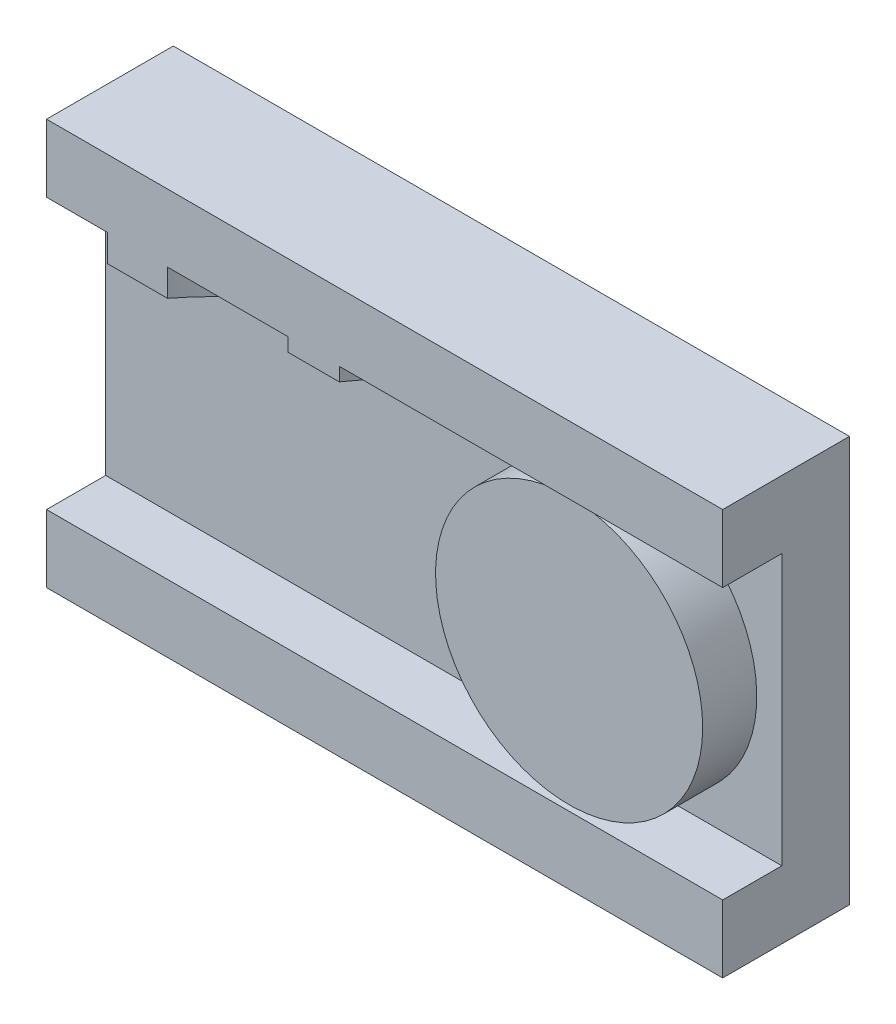
ISO-10303-21;
HEADER;
FILE_DESCRIPTION(('STEP AP214'),'2;1');
FILE_NAME('part.step','',(''),(''),'','','');
FILE_SCHEMA(('AUTOMOTIVE_DESIGN { 1 0 10303 214 1 1 1 1 }'));
ENDSEC;
DATA;
#1=APPLICATION_CONTEXT('core data for automotive mechanical design processes');
#2=APPLICATION_PROTOCOL_DEFINITION('international standard','automotive_design',2000,#1);
#3=PRODUCT_CONTEXT('',#1,'mechanical');
#4=PRODUCT('Part','Part','',(#3));
#5=PRODUCT_RELATED_PRODUCT_CATEGORY('part','',(#4));
#6=PRODUCT_DEFINITION_FORMATION('','',#4);
#7=PRODUCT_DEFINITION_CONTEXT('part definition',#1,'design');
#8=PRODUCT_DEFINITION('design','',#6,#7);
#9=PRODUCT_DEFINITION_SHAPE('','',#8);
#10=(LENGTH_UNIT() NAMED_UNIT(*) SI_UNIT(.MILLI.,.METRE.));
#11=(NAMED_UNIT(*) PLANE_ANGLE_UNIT() SI_UNIT($,.RADIAN.));
#12=(NAMED_UNIT(*) SI_UNIT($,.STERADIAN.) SOLID_ANGLE_UNIT());
#13=UNCERTAINTY_MEASURE_WITH_UNIT(LENGTH_MEASURE(1.E-05),#10,'distance_accuracy_value','');
#14=(GEOMETRIC_REPRESENTATION_CONTEXT(3) GLOBAL_UNCERTAINTY_ASSIGNED_CONTEXT((#13)) GLOBAL_UNIT_ASSIGNED_CONTEXT((#10,
#11,#12)) REPRESENTATION_CONTEXT('',''));
#15=CARTESIAN_POINT('',(0.,0.,0.));
#16=DIRECTION('',(0.,0.,1.));
#17=DIRECTION('',(1.,0.,0.));
#18=AXIS2_PLACEMENT_3D('',#15,#16,#17);
#19=CARTESIAN_POINT('',(50.,18.5267857142857,0.));
#20=DIRECTION('',(0.,-1.,0.));
#21=DIRECTION('',(0.,0.,-1.));
#22=AXIS2_PLACEMENT_3D('',#19,#20,#21);
#23=PLANE('',#22);
#24=DIRECTION('',(1.,0.,0.));
#25=VECTOR('',#24,1.);
#26=CARTESIAN_POINT('',(50.,18.5267857142857,-5.09184128727336));
#27=LINE('',#26,#25);
#28=CARTESIAN_POINT('',(21.6480697283801,18.5267857142857,-5.09184128727337));
#29=VERTEX_POINT('',#28);
#30=CARTESIAN_POINT('',(50.,18.5267857142857,-5.09184128727336));
#31=VERTEX_POINT('',#30);
#32=EDGE_CURVE('E368',#29,#31,#27,.T.);
#33=ORIENTED_EDGE('',*,*,#32,.F.);
#34=CARTESIAN_POINT('',(26.8387800005201,18.5267857142857,-10.3178478614672));
#35=CARTESIAN_POINT('',(18.7957978385717,18.5267857142857,-4.39926270418809));
#36=CARTESIAN_POINT('',(17.8655187539285,18.5267857142857,5.5357142857143));
#37=B_SPLINE_CURVE_WITH_KNOTS('',2,(#34,#35,#36),.UNSPECIFIED.,.F.,.F.,(3,3),(0.,1.),.UNSPECIFIED.);
#38=CARTESIAN_POINT('',(25.7411912462014,18.5267857142857,-9.4642857142857));
#39=VERTEX_POINT('',#38);
#40=EDGE_CURVE('E244',#39,#29,#37,.T.);
#41=ORIENTED_EDGE('',*,*,#40,.F.);
#42=DIRECTION('',(-1.,0.,0.));
#43=VECTOR('',#42,1.);
#44=CARTESIAN_POINT('',(50.,18.5267857142857,-9.4642857142857));
#45=LINE('',#44,#43);
#46=CARTESIAN_POINT('',(50.,18.5267857142857,-9.4642857142857));
#47=VERTEX_POINT('',#46);
#48=EDGE_CURVE('E221',#47,#39,#45,.T.);
#49=ORIENTED_EDGE('',*,*,#48,.F.);
#50=DIRECTION('',(0.,0.,1.));
#51=VECTOR('',#50,1.);
#52=CARTESIAN_POINT('',(50.,18.5267857142857,0.));
#53=LINE('',#52,#51);
#54=EDGE_CURVE('E331',#47,#31,#53,.T.);
#55=ORIENTED_EDGE('',*,*,#54,.T.);
#56=EDGE_LOOP('',(#33,#41,#49,#55));
#57=FACE_BOUND('',#56,.T.);
#58=ADVANCED_FACE('F45',(#57),#23,.T.);
#59=DIRECTION('',(1.,0.,0.));
#60=VECTOR('',#59,1.);
#61=CARTESIAN_POINT('',(50.,18.5267857142857,-5.09184128727336));
#62=LINE('',#61,#60);
#63=CARTESIAN_POINT('',(8.94446296302273,18.5267857142857,-5.09184128727336));
#64=VERTEX_POINT('',#63);
#65=CARTESIAN_POINT('',(17.8655187539285,18.5267857142857,-5.09184128727336));
#66=VERTEX_POINT('',#65);
#67=EDGE_CURVE('E371',#64,#66,#62,.T.);
#68=ORIENTED_EDGE('',*,*,#67,.F.);
#69=CARTESIAN_POINT('',(13.4890210497574,18.5267857142857,-9.4642857142857));
#70=CARTESIAN_POINT('',(5.84878698161383,18.5267857142857,-3.8061363426659));
#71=CARTESIAN_POINT('',(4.51575980316576,18.5267857142857,5.5357142857143));
#72=B_SPLINE_CURVE_WITH_KNOTS('',2,(#69,#70,#71),.UNSPECIFIED.,.F.,.F.,(3,3),(0.,1.),.UNSPECIFIED.);
#73=CARTESIAN_POINT('',(13.4890210497574,18.5267857142857,-9.4642857142857));
#74=VERTEX_POINT('',#73);
#75=EDGE_CURVE('E307',#74,#64,#72,.T.);
#76=ORIENTED_EDGE('',*,*,#75,.F.);
#77=CARTESIAN_POINT('',(17.8655187539285,18.5267857142857,-9.4642857142857));
#78=VERTEX_POINT('',#77);
#79=EDGE_CURVE('E226',#78,#74,#45,.T.);
#80=ORIENTED_EDGE('',*,*,#79,.F.);
#81=DIRECTION('',(0.,0.,-1.));
#82=VECTOR('',#81,1.);
#83=CARTESIAN_POINT('',(17.8655187539285,18.5267857142857,-10.3178478614672));
#84=LINE('',#83,#82);
#85=EDGE_CURVE('E252',#66,#78,#84,.T.);
#86=ORIENTED_EDGE('',*,*,#85,.F.);
#87=EDGE_LOOP('',(#68,#76,#80,#86));
#88=FACE_BOUND('',#87,.T.);
#89=ADVANCED_FACE('F416',(#88),#23,.T.);
#90=CARTESIAN_POINT('',(50.,0.,-9.4642857142857));
#91=DIRECTION('',(0.,0.,-1.));
#92=DIRECTION('',(0.,1.,0.));
#93=AXIS2_PLACEMENT_3D('',#90,#91,#92);
#94=PLANE('',#93);
#95=CARTESIAN_POINT('',(38.2696022766316,8.44587350528188,-9.4642857142857));
#96=DIRECTION('',(0.,0.,-1.));
#97=DIRECTION('',(0.,1.,0.));
#98=AXIS2_PLACEMENT_3D('',#95,#96,#97);
#99=CIRCLE('',#98,9.87659379197378);
#100=CARTESIAN_POINT('',(38.2696022766316,18.3224672972557,-9.4642857142857));
#101=VERTEX_POINT('',#100);
#102=EDGE_CURVE('E11',#101,#101,#99,.F.);
#103=ORIENTED_EDGE('',*,*,#102,.F.);
#104=EDGE_LOOP('',(#103));
#105=FACE_BOUND('',#104,.T.);
#106=DIRECTION('',(0.,1.,0.));
#107=VECTOR('',#106,1.);
#108=CARTESIAN_POINT('',(25.741191258021,17.5267857142857,-9.4642857142857));
#109=LINE('',#108,#107);
#110=CARTESIAN_POINT('',(25.7411912462014,17.5267857142857,-9.46428570456712));
#111=VERTEX_POINT('',#110);
#112=EDGE_CURVE('E256',#111,#39,#109,.T.);
#113=ORIENTED_EDGE('',*,*,#112,.F.);
#114=DIRECTION('',(1.,0.,0.));
#115=VECTOR('',#114,1.);
#116=CARTESIAN_POINT('',(50.,17.5267857142857,-9.4642857142857));
#117=LINE('',#116,#115);
#118=CARTESIAN_POINT('',(17.8655187539285,17.5267857142857,-9.4642857142857));
#119=VERTEX_POINT('',#118);
#120=EDGE_CURVE('E229',#119,#111,#117,.T.);
#121=ORIENTED_EDGE('',*,*,#120,.F.);
#122=DIRECTION('',(0.,-1.,0.));
#123=VECTOR('',#122,1.);
#124=CARTESIAN_POINT('',(17.8655187539285,0.,-9.4642857142857));
#125=LINE('',#124,#123);
#126=EDGE_CURVE('E233',#78,#119,#125,.T.);
#127=ORIENTED_EDGE('',*,*,#126,.F.);
#128=ORIENTED_EDGE('',*,*,#79,.T.);
#129=DIRECTION('',(0.,1.,0.));
#130=VECTOR('',#129,1.);
#131=CARTESIAN_POINT('',(13.4890210497574,16.5267857142857,-9.4642857142857));
#132=LINE('',#131,#130);
#133=CARTESIAN_POINT('',(13.4890210497574,16.5267857142857,-9.4642857142857));
#134=VERTEX_POINT('',#133);
#135=EDGE_CURVE('E198',#134,#74,#132,.T.);
#136=ORIENTED_EDGE('',*,*,#135,.F.);
#137=DIRECTION('',(1.,0.,0.));
#138=VECTOR('',#137,1.);
#139=CARTESIAN_POINT('',(4.51575980316576,16.5267857142857,-9.4642857142857));
#140=LINE('',#139,#138);
#141=CARTESIAN_POINT('',(4.51575980316576,16.5267857142857,-9.4642857142857));
#142=VERTEX_POINT('',#141);
#143=EDGE_CURVE('E299',#142,#134,#140,.T.);
#144=ORIENTED_EDGE('',*,*,#143,.F.);
#145=DIRECTION('',(0.,1.,0.));
#146=VECTOR('',#145,1.);
#147=CARTESIAN_POINT('',(4.51575980316576,16.5267857142857,-9.4642857142857));
#148=LINE('',#147,#146);
#149=CARTESIAN_POINT('',(4.51575980316576,18.5267857142857,-9.4642857142857));
#150=VERTEX_POINT('',#149);
#151=EDGE_CURVE('E306',#142,#150,#148,.T.);
#152=ORIENTED_EDGE('',*,*,#151,.T.);
#153=CARTESIAN_POINT('',(0.,18.5267857142857,-9.4642857142857));
#154=VERTEX_POINT('',#153);
#155=EDGE_CURVE('E220',#150,#154,#45,.T.);
#156=ORIENTED_EDGE('',*,*,#155,.T.);
#157=DIRECTION('',(0.,-1.,0.));
#158=VECTOR('',#157,1.);
#159=CARTESIAN_POINT('',(0.,0.,-9.4642857142857));
#160=LINE('',#159,#158);
#161=CARTESIAN_POINT('',(0.,-1.47321428571427,-9.4642857142857));
#162=VERTEX_POINT('',#161);
#163=EDGE_CURVE('E206',#154,#162,#160,.T.);
#164=ORIENTED_EDGE('',*,*,#163,.T.);
#165=DIRECTION('',(-1.,0.,0.));
#166=VECTOR('',#165,1.);
#167=CARTESIAN_POINT('',(50.,-1.47321428571427,-9.4642857142857));
#168=LINE('',#167,#166);
#169=CARTESIAN_POINT('',(50.,-1.47321428571427,-9.4642857142857));
#170=VERTEX_POINT('',#169);
#171=EDGE_CURVE('E187',#170,#162,#168,.T.);
#172=ORIENTED_EDGE('',*,*,#171,.F.);
#173=DIRECTION('',(0.,-1.,0.));
#174=VECTOR('',#173,1.);
#175=CARTESIAN_POINT('',(50.,0.,-9.4642857142857));
#176=LINE('',#175,#174);
#177=EDGE_CURVE('E189',#47,#170,#176,.T.);
#178=ORIENTED_EDGE('',*,*,#177,.F.);
#179=ORIENTED_EDGE('',*,*,#48,.T.);
#180=EDGE_LOOP('',(#113,#121,#127,#128,#136,#144,#152,#156,#164,#172,#178,#179));
#181=FACE_BOUND('',#180,.T.);
#182=ADVANCED_FACE('F340',(#105,#181),#94,.F.);
#183=DIRECTION('',(1.,0.,0.));
#184=VECTOR('',#183,1.);
#185=CARTESIAN_POINT('',(50.,18.5267857142857,-5.09184128727336));
#186=LINE('',#185,#184);
#187=CARTESIAN_POINT('',(0.,18.5267857142857,-5.09184128727336));
#188=VERTEX_POINT('',#187);
#189=CARTESIAN_POINT('',(4.51575980316576,18.5267857142857,-5.09184128727336));
#190=VERTEX_POINT('',#189);
#191=EDGE_CURVE('E352',#188,#190,#186,.T.);
#192=ORIENTED_EDGE('',*,*,#191,.F.);
#193=DIRECTION('',(0.,0.,1.));
#194=VECTOR('',#193,1.);
#195=CARTESIAN_POINT('',(0.,18.5267857142857,0.));
#196=LINE('',#195,#194);
#197=EDGE_CURVE('E202',#154,#188,#196,.T.);
#198=ORIENTED_EDGE('',*,*,#197,.F.);
#199=ORIENTED_EDGE('',*,*,#155,.F.);
#200=DIRECTION('',(0.,0.,-1.));
#201=VECTOR('',#200,1.);
#202=CARTESIAN_POINT('',(4.51575980316576,18.5267857142857,-9.4642857142857));
#203=LINE('',#202,#201);
#204=EDGE_CURVE('E313',#190,#150,#203,.T.);
#205=ORIENTED_EDGE('',*,*,#204,.F.);
#206=EDGE_LOOP('',(#192,#198,#199,#205));
#207=FACE_BOUND('',#206,.T.);
#208=ADVANCED_FACE('F399',(#207),#23,.T.);
#209=CARTESIAN_POINT('',(50.,0.,-14.4642857142857));
#210=DIRECTION('',(0.,0.,-1.));
#211=DIRECTION('',(0.,1.,0.));
#212=AXIS2_PLACEMENT_3D('',#209,#210,#211);
#213=PLANE('',#212);
#214=DIRECTION('',(0.,-1.,0.));
#215=VECTOR('',#214,1.);
#216=CARTESIAN_POINT('',(0.,0.,-14.4642857142857));
#217=LINE('',#216,#215);
#218=CARTESIAN_POINT('',(0.,23.5267857142857,-14.4642857142857));
#219=VERTEX_POINT('',#218);
#220=CARTESIAN_POINT('',(0.,-6.47321428571427,-14.4642857142857));
#221=VERTEX_POINT('',#220);
#222=EDGE_CURVE('E193',#219,#221,#217,.T.);
#223=ORIENTED_EDGE('',*,*,#222,.F.);
#224=DIRECTION('',(-1.,0.,0.));
#225=VECTOR('',#224,1.);
#226=CARTESIAN_POINT('',(50.,23.5267857142857,-14.4642857142857));
#227=LINE('',#226,#225);
#228=CARTESIAN_POINT('',(50.,23.5267857142857,-14.4642857142857));
#229=VERTEX_POINT('',#228);
#230=EDGE_CURVE('E225',#229,#219,#227,.T.);
#231=ORIENTED_EDGE('',*,*,#230,.F.);
#232=DIRECTION('',(0.,-1.,0.));
#233=VECTOR('',#232,1.);
#234=CARTESIAN_POINT('',(50.,0.,-14.4642857142857));
#235=LINE('',#234,#233);
#236=CARTESIAN_POINT('',(50.,-6.47321428571427,-14.4642857142857));
#237=VERTEX_POINT('',#236);
#238=EDGE_CURVE('E215',#229,#237,#235,.T.);
#239=ORIENTED_EDGE('',*,*,#238,.T.);
#240=DIRECTION('',(-1.,0.,0.));
#241=VECTOR('',#240,1.);
#242=CARTESIAN_POINT('',(50.,-6.47321428571427,-14.4642857142857));
#243=LINE('',#242,#241);
#244=EDGE_CURVE('E181',#237,#221,#243,.T.);
#245=ORIENTED_EDGE('',*,*,#244,.T.);
#246=EDGE_LOOP('',(#223,#231,#239,#245));
#247=FACE_BOUND('',#246,.T.);
#248=ADVANCED_FACE('F47',(#247),#213,.T.);
#249=CARTESIAN_POINT('',(50.,23.5267857142857,0.));
#250=DIRECTION('',(0.,-1.,0.));
#251=DIRECTION('',(0.,0.,-1.));
#252=AXIS2_PLACEMENT_3D('',#249,#250,#251);
#253=PLANE('',#252);
#254=DIRECTION('',(0.,0.,1.));
#255=VECTOR('',#254,1.);
#256=CARTESIAN_POINT('',(0.,23.5267857142857,0.));
#257=LINE('',#256,#255);
#258=CARTESIAN_POINT('',(0.,23.5267857142857,-5.09184128727336));
#259=VERTEX_POINT('',#258);
#260=EDGE_CURVE('E197',#219,#259,#257,.T.);
#261=ORIENTED_EDGE('',*,*,#260,.T.);
#262=DIRECTION('',(1.,0.,0.));
#263=VECTOR('',#262,1.);
#264=CARTESIAN_POINT('',(-360.,23.5267857142857,-5.09184128727336));
#265=LINE('',#264,#263);
#266=CARTESIAN_POINT('',(50.,23.5267857142857,-5.09184128727336));
#267=VERTEX_POINT('',#266);
#268=EDGE_CURVE('E166',#259,#267,#265,.T.);
#269=ORIENTED_EDGE('',*,*,#268,.T.);
#270=DIRECTION('',(0.,0.,1.));
#271=VECTOR('',#270,1.);
#272=CARTESIAN_POINT('',(50.,23.5267857142857,0.));
#273=LINE('',#272,#271);
#274=EDGE_CURVE('E327',#229,#267,#273,.T.);
#275=ORIENTED_EDGE('',*,*,#274,.F.);
#276=ORIENTED_EDGE('',*,*,#230,.T.);
#277=EDGE_LOOP('',(#261,#269,#275,#276));
#278=FACE_BOUND('',#277,.T.);
#279=ADVANCED_FACE('F391',(#278),#253,.F.);
#280=CARTESIAN_POINT('',(50.,-1.47321428571427,0.));
#281=DIRECTION('',(0.,1.,0.));
#282=DIRECTION('',(0.,0.,1.));
#283=AXIS2_PLACEMENT_3D('',#280,#281,#282);
#284=PLANE('',#283);
#285=DIRECTION('',(-1.,0.,0.));
#286=VECTOR('',#285,1.);
#287=CARTESIAN_POINT('',(50.,-1.47321428571427,-5.09184128727336));
#288=LINE('',#287,#286);
#289=CARTESIAN_POINT('',(50.,-1.47321428571427,-5.09184128727336));
#290=VERTEX_POINT('',#289);
#291=CARTESIAN_POINT('',(0.,-1.47321428571427,-5.09184128727336));
#292=VERTEX_POINT('',#291);
#293=EDGE_CURVE('E61',#290,#292,#288,.T.);
#294=ORIENTED_EDGE('',*,*,#293,.F.);
#295=DIRECTION('',(0.,0.,-1.));
#296=VECTOR('',#295,1.);
#297=CARTESIAN_POINT('',(50.,-1.47321428571427,0.));
#298=LINE('',#297,#296);
#299=EDGE_CURVE('E175',#290,#170,#298,.T.);
#300=ORIENTED_EDGE('',*,*,#299,.T.);
#301=ORIENTED_EDGE('',*,*,#171,.T.);
#302=DIRECTION('',(0.,0.,-1.));
#303=VECTOR('',#302,1.);
#304=CARTESIAN_POINT('',(0.,-1.47321428571427,0.));
#305=LINE('',#304,#303);
#306=EDGE_CURVE('E210',#292,#162,#305,.T.);
#307=ORIENTED_EDGE('',*,*,#306,.F.);
#308=EDGE_LOOP('',(#294,#300,#301,#307));
#309=FACE_BOUND('',#308,.T.);
#310=ADVANCED_FACE('F344',(#309),#284,.T.);
#311=CARTESIAN_POINT('',(50.,-6.47321428571427,0.));
#312=DIRECTION('',(0.,1.,0.));
#313=DIRECTION('',(0.,0.,1.));
#314=AXIS2_PLACEMENT_3D('',#311,#312,#313);
#315=PLANE('',#314);
#316=DIRECTION('',(0.,0.,-1.));
#317=VECTOR('',#316,1.);
#318=CARTESIAN_POINT('',(50.,-6.47321428571427,0.));
#319=LINE('',#318,#317);
#320=CARTESIAN_POINT('',(50.,-6.47321428571427,-5.09184128727336));
#321=VERTEX_POINT('',#320);
#322=EDGE_CURVE('E172',#321,#237,#319,.T.);
#323=ORIENTED_EDGE('',*,*,#322,.F.);
#324=DIRECTION('',(1.,0.,0.));
#325=VECTOR('',#324,1.);
#326=CARTESIAN_POINT('',(-360.,-6.47321428571427,-5.09184128727336));
#327=LINE('',#326,#325);
#328=CARTESIAN_POINT('',(0.,-6.47321428571427,-5.09184128727336));
#329=VERTEX_POINT('',#328);
#330=EDGE_CURVE('E157',#329,#321,#327,.T.);
#331=ORIENTED_EDGE('',*,*,#330,.F.);
#332=DIRECTION('',(0.,0.,-1.));
#333=VECTOR('',#332,1.);
#334=CARTESIAN_POINT('',(0.,-6.47321428571427,0.));
#335=LINE('',#334,#333);
#336=EDGE_CURVE('E213',#329,#221,#335,.T.);
#337=ORIENTED_EDGE('',*,*,#336,.T.);
#338=ORIENTED_EDGE('',*,*,#244,.F.);
#339=EDGE_LOOP('',(#323,#331,#337,#338));
#340=FACE_BOUND('',#339,.T.);
#341=ADVANCED_FACE('F179',(#340),#315,.F.);
#342=CARTESIAN_POINT('',(50.,0.,0.));
#343=DIRECTION('',(1.,0.,0.));
#344=DIRECTION('',(0.,0.,-1.));
#345=AXIS2_PLACEMENT_3D('',#342,#343,#344);
#346=PLANE('',#345);
#347=DIRECTION('',(0.,1.,0.));
#348=VECTOR('',#347,1.);
#349=CARTESIAN_POINT('',(50.,23.5267857142857,-5.09184128727336));
#350=LINE('',#349,#348);
#351=EDGE_CURVE('E160',#321,#290,#350,.T.);
#352=ORIENTED_EDGE('',*,*,#351,.F.);
#353=ORIENTED_EDGE('',*,*,#322,.T.);
#354=ORIENTED_EDGE('',*,*,#238,.F.);
#355=ORIENTED_EDGE('',*,*,#274,.T.);
#356=EDGE_CURVE('E177',#31,#267,#350,.T.);
#357=ORIENTED_EDGE('',*,*,#356,.F.);
#358=ORIENTED_EDGE('',*,*,#54,.F.);
#359=ORIENTED_EDGE('',*,*,#177,.T.);
#360=ORIENTED_EDGE('',*,*,#299,.F.);
#361=EDGE_LOOP('',(#352,#353,#354,#355,#357,#358,#359,#360));
#362=FACE_BOUND('',#361,.T.);
#363=ADVANCED_FACE('F170',(#362),#346,.T.);
#364=CARTESIAN_POINT('',(0.,0.,0.));
#365=DIRECTION('',(1.,0.,0.));
#366=DIRECTION('',(0.,0.,-1.));
#367=AXIS2_PLACEMENT_3D('',#364,#365,#366);
#368=PLANE('',#367);
#369=ORIENTED_EDGE('',*,*,#336,.F.);
#370=DIRECTION('',(0.,1.,0.));
#371=VECTOR('',#370,1.);
#372=CARTESIAN_POINT('',(0.,0.,-5.09184128727336));
#373=LINE('',#372,#371);
#374=EDGE_CURVE('E161',#329,#292,#373,.T.);
#375=ORIENTED_EDGE('',*,*,#374,.T.);
#376=ORIENTED_EDGE('',*,*,#306,.T.);
#377=ORIENTED_EDGE('',*,*,#163,.F.);
#378=ORIENTED_EDGE('',*,*,#197,.T.);
#379=EDGE_CURVE('E348',#188,#259,#373,.T.);
#380=ORIENTED_EDGE('',*,*,#379,.T.);
#381=ORIENTED_EDGE('',*,*,#260,.F.);
#382=ORIENTED_EDGE('',*,*,#222,.T.);
#383=EDGE_LOOP('',(#369,#375,#376,#377,#378,#380,#381,#382));
#384=FACE_BOUND('',#383,.T.);
#385=ADVANCED_FACE('F287',(#384),#368,.F.);
#386=CARTESIAN_POINT('',(13.4890210497574,16.5267857142857,-9.4642857142857));
#387=CARTESIAN_POINT('',(5.84878698161383,16.5267857142857,-3.8061363426659));
#388=CARTESIAN_POINT('',(4.51575980316576,16.5267857142857,5.5357142857143));
#389=B_SPLINE_CURVE_WITH_KNOTS('',2,(#386,#387,#388),.UNSPECIFIED.,.F.,.F.,(3,3),(0.,1.),.UNSPECIFIED.);
#390=DIRECTION('',(0.,1.,0.));
#391=VECTOR('',#390,1.);
#392=SURFACE_OF_LINEAR_EXTRUSION('',#389,#391);
#393=ORIENTED_EDGE('',*,*,#75,.T.);
#394=DIRECTION('',(0.,1.,0.));
#395=VECTOR('',#394,1.);
#396=CARTESIAN_POINT('',(8.94446296302109,16.5267857142857,-5.09184128727336));
#397=LINE('',#396,#395);
#398=CARTESIAN_POINT('',(8.94446296302109,16.5267857142857,-5.09184128727336));
#399=VERTEX_POINT('',#398);
#400=EDGE_CURVE('E364',#64,#399,#397,.F.);
#401=ORIENTED_EDGE('',*,*,#400,.T.);
#402=EDGE_CURVE('E290',#134,#399,#389,.T.);
#403=ORIENTED_EDGE('',*,*,#402,.F.);
#404=ORIENTED_EDGE('',*,*,#135,.T.);
#405=EDGE_LOOP('',(#393,#401,#403,#404));
#406=FACE_BOUND('',#405,.T.);
#407=ADVANCED_FACE('F282',(#406),#392,.F.);
#408=CARTESIAN_POINT('',(4.51575980316576,16.5267857142857,-9.4642857142857));
#409=DIRECTION('',(1.,0.,0.));
#410=DIRECTION('',(0.,0.,-1.));
#411=AXIS2_PLACEMENT_3D('',#408,#409,#410);
#412=PLANE('',#411);
#413=DIRECTION('',(0.,0.,-1.));
#414=VECTOR('',#413,1.);
#415=CARTESIAN_POINT('',(4.51575980316576,16.5267857142857,-9.4642857142857));
#416=LINE('',#415,#414);
#417=CARTESIAN_POINT('',(4.51575980316576,16.5267857142857,-5.09184128727336));
#418=VERTEX_POINT('',#417);
#419=EDGE_CURVE('E298',#418,#142,#416,.T.);
#420=ORIENTED_EDGE('',*,*,#419,.F.);
#421=DIRECTION('',(0.,1.,0.));
#422=VECTOR('',#421,1.);
#423=CARTESIAN_POINT('',(4.51575980316576,16.5267857142857,-5.09184128727336));
#424=LINE('',#423,#422);
#425=EDGE_CURVE('E356',#418,#190,#424,.T.);
#426=ORIENTED_EDGE('',*,*,#425,.T.);
#427=ORIENTED_EDGE('',*,*,#204,.T.);
#428=ORIENTED_EDGE('',*,*,#151,.F.);
#429=EDGE_LOOP('',(#420,#426,#427,#428));
#430=FACE_BOUND('',#429,.T.);
#431=ADVANCED_FACE('F278',(#430),#412,.F.);
#432=CARTESIAN_POINT('',(7.4255887040377,16.5267857142857,-2.8852110284758));
#433=DIRECTION('',(0.,1.,0.));
#434=DIRECTION('',(0.,0.,1.));
#435=AXIS2_PLACEMENT_3D('',#432,#433,#434);
#436=PLANE('',#435);
#437=ORIENTED_EDGE('',*,*,#402,.T.);
#438=DIRECTION('',(-1.,0.,0.));
#439=VECTOR('',#438,1.);
#440=CARTESIAN_POINT('',(7.4255887040377,16.5267857142857,-5.09184128727336));
#441=LINE('',#440,#439);
#442=EDGE_CURVE('E360',#399,#418,#441,.T.);
#443=ORIENTED_EDGE('',*,*,#442,.T.);
#444=ORIENTED_EDGE('',*,*,#419,.T.);
#445=ORIENTED_EDGE('',*,*,#143,.T.);
#446=EDGE_LOOP('',(#437,#443,#444,#445));
#447=FACE_BOUND('',#446,.T.);
#448=ADVANCED_FACE('F275',(#447),#436,.F.);
#449=CARTESIAN_POINT('',(17.8655187539285,17.5267857142857,-10.3178478614672));
#450=DIRECTION('',(1.,0.,0.));
#451=DIRECTION('',(0.,0.,-1.));
#452=AXIS2_PLACEMENT_3D('',#449,#450,#451);
#453=PLANE('',#452);
#454=DIRECTION('',(0.,0.,-1.));
#455=VECTOR('',#454,1.);
#456=CARTESIAN_POINT('',(17.8655187539285,17.5267857142857,-10.3178478614672));
#457=LINE('',#456,#455);
#458=CARTESIAN_POINT('',(17.8655187539285,17.5267857142857,-5.09184128727336));
#459=VERTEX_POINT('',#458);
#460=EDGE_CURVE('E251',#459,#119,#457,.T.);
#461=ORIENTED_EDGE('',*,*,#460,.F.);
#462=DIRECTION('',(0.,1.,0.));
#463=VECTOR('',#462,1.);
#464=CARTESIAN_POINT('',(17.8655187539285,17.5267857142857,-5.09184128727336));
#465=LINE('',#464,#463);
#466=EDGE_CURVE('E374',#459,#66,#465,.T.);
#467=ORIENTED_EDGE('',*,*,#466,.T.);
#468=ORIENTED_EDGE('',*,*,#85,.T.);
#469=ORIENTED_EDGE('',*,*,#126,.T.);
#470=EDGE_LOOP('',(#461,#467,#468,#469));
#471=FACE_BOUND('',#470,.T.);
#472=ADVANCED_FACE('F273',(#471),#453,.F.);
#473=CARTESIAN_POINT('',(20.573973607898,17.5267857142857,-3.39516474603226));
#474=DIRECTION('',(0.,1.,0.));
#475=DIRECTION('',(-1.,0.,0.));
#476=AXIS2_PLACEMENT_3D('',#473,#474,#475);
#477=PLANE('',#476);
#478=CARTESIAN_POINT('',(26.8387800005201,17.5267857142857,-10.3178478614672));
#479=CARTESIAN_POINT('',(18.7957978385717,17.5267857142857,-4.39926270418809));
#480=CARTESIAN_POINT('',(17.8655187539285,17.5267857142857,5.5357142857143));
#481=B_SPLINE_CURVE_WITH_KNOTS('',2,(#478,#479,#480),.UNSPECIFIED.,.F.,.F.,(3,3),(0.,1.),.UNSPECIFIED.);
#482=CARTESIAN_POINT('',(21.6480697283801,17.5267857142857,-5.09184128727337));
#483=VERTEX_POINT('',#482);
#484=EDGE_CURVE('E243',#111,#483,#481,.T.);
#485=ORIENTED_EDGE('',*,*,#484,.T.);
#486=DIRECTION('',(-1.,0.,0.));
#487=VECTOR('',#486,1.);
#488=CARTESIAN_POINT('',(20.573973607898,17.5267857142857,-5.09184128727336));
#489=LINE('',#488,#487);
#490=EDGE_CURVE('E69',#483,#459,#489,.T.);
#491=ORIENTED_EDGE('',*,*,#490,.T.);
#492=ORIENTED_EDGE('',*,*,#460,.T.);
#493=ORIENTED_EDGE('',*,*,#120,.T.);
#494=EDGE_LOOP('',(#485,#491,#492,#493));
#495=FACE_BOUND('',#494,.T.);
#496=ADVANCED_FACE('F247',(#495),#477,.F.);
#497=DIRECTION('',(0.,1.,0.));
#498=VECTOR('',#497,1.);
#499=SURFACE_OF_LINEAR_EXTRUSION('',#481,#498);
#500=ORIENTED_EDGE('',*,*,#40,.T.);
#501=DIRECTION('',(0.,1.,0.));
#502=VECTOR('',#501,1.);
#503=CARTESIAN_POINT('',(21.6480697283801,17.5267857142857,-5.09184128727337));
#504=LINE('',#503,#502);
#505=EDGE_CURVE('E54',#29,#483,#504,.F.);
#506=ORIENTED_EDGE('',*,*,#505,.T.);
#507=ORIENTED_EDGE('',*,*,#484,.F.);
#508=ORIENTED_EDGE('',*,*,#112,.T.);
#509=EDGE_LOOP('',(#500,#506,#507,#508));
#510=FACE_BOUND('',#509,.T.);
#511=ADVANCED_FACE('F241',(#510),#499,.F.);
#512=CARTESIAN_POINT('',(-360.,23.5267857142857,-5.09184128727336));
#513=DIRECTION('',(0.,0.,-1.));
#514=DIRECTION('',(-1.,0.,0.));
#515=AXIS2_PLACEMENT_3D('',#512,#513,#514);
#516=PLANE('',#515);
#517=ORIENTED_EDGE('',*,*,#191,.T.);
#518=ORIENTED_EDGE('',*,*,#425,.F.);
#519=ORIENTED_EDGE('',*,*,#442,.F.);
#520=ORIENTED_EDGE('',*,*,#400,.F.);
#521=ORIENTED_EDGE('',*,*,#67,.T.);
#522=ORIENTED_EDGE('',*,*,#466,.F.);
#523=ORIENTED_EDGE('',*,*,#490,.F.);
#524=ORIENTED_EDGE('',*,*,#505,.F.);
#525=ORIENTED_EDGE('',*,*,#32,.T.);
#526=ORIENTED_EDGE('',*,*,#356,.T.);
#527=ORIENTED_EDGE('',*,*,#268,.F.);
#528=ORIENTED_EDGE('',*,*,#379,.F.);
#529=EDGE_LOOP('',(#517,#518,#519,#520,#521,#522,#523,#524,#525,#526,#527,#528));
#530=FACE_BOUND('',#529,.T.);
#531=ADVANCED_FACE('F272',(#530),#516,.F.);
#532=ORIENTED_EDGE('',*,*,#293,.T.);
#533=ORIENTED_EDGE('',*,*,#374,.F.);
#534=ORIENTED_EDGE('',*,*,#330,.T.);
#535=ORIENTED_EDGE('',*,*,#351,.T.);
#536=EDGE_LOOP('',(#532,#533,#534,#535));
#537=FACE_BOUND('',#536,.T.);
#538=ADVANCED_FACE('F159',(#537),#516,.F.);
#539=CARTESIAN_POINT('',(38.2696022766316,8.44587350528188,-5.4642857142857));
#540=DIRECTION('',(0.,0.,-1.));
#541=DIRECTION('',(-1.,0.,0.));
#542=AXIS2_PLACEMENT_3D('',#539,#540,#541);
#543=CYLINDRICAL_SURFACE('',#542,9.87659379197378);
#544=CARTESIAN_POINT('',(38.2696022766316,8.44587350528188,-5.4642857142857));
#545=DIRECTION('',(0.,0.,1.));
#546=DIRECTION('',(1.,0.,0.));
#547=AXIS2_PLACEMENT_3D('',#544,#545,#546);
#548=CIRCLE('',#547,9.87659379197378);
#549=CARTESIAN_POINT('',(48.1461960686054,8.44587350528188,-5.4642857142857));
#550=VERTEX_POINT('',#549);
#551=EDGE_CURVE('E383',#550,#550,#548,.T.);
#552=ORIENTED_EDGE('',*,*,#551,.F.);
#553=EDGE_LOOP('',(#552));
#554=FACE_BOUND('',#553,.T.);
#555=ORIENTED_EDGE('',*,*,#102,.T.);
#556=EDGE_LOOP('',(#555));
#557=FACE_BOUND('',#556,.T.);
#558=ADVANCED_FACE('F554',(#554,#557),#543,.T.);
#559=CARTESIAN_POINT('',(38.2696022766316,8.44587350528188,-5.4642857142857));
#560=DIRECTION('',(0.,0.,1.));
#561=DIRECTION('',(1.,0.,0.));
#562=AXIS2_PLACEMENT_3D('',#559,#560,#561);
#563=PLANE('',#562);
#564=ORIENTED_EDGE('',*,*,#551,.T.);
#565=EDGE_LOOP('',(#564));
#566=FACE_BOUND('',#565,.T.);
#567=ADVANCED_FACE('F561',(#566),#563,.T.);
#568=CLOSED_SHELL('',(#58,#89,#182,#208,#248,#279,#310,#341,#363,#385,#407,#431,#448,#472,#496,
#511,#531,#538,#558,#567));
#569=MANIFOLD_SOLID_BREP('B2',#568);
#570=ADVANCED_BREP_SHAPE_REPRESENTATION('',(#18,#569),#14);
#571=SHAPE_DEFINITION_REPRESENTATION(#9,#570);
ENDSEC;
END-ISO-10303-21;
